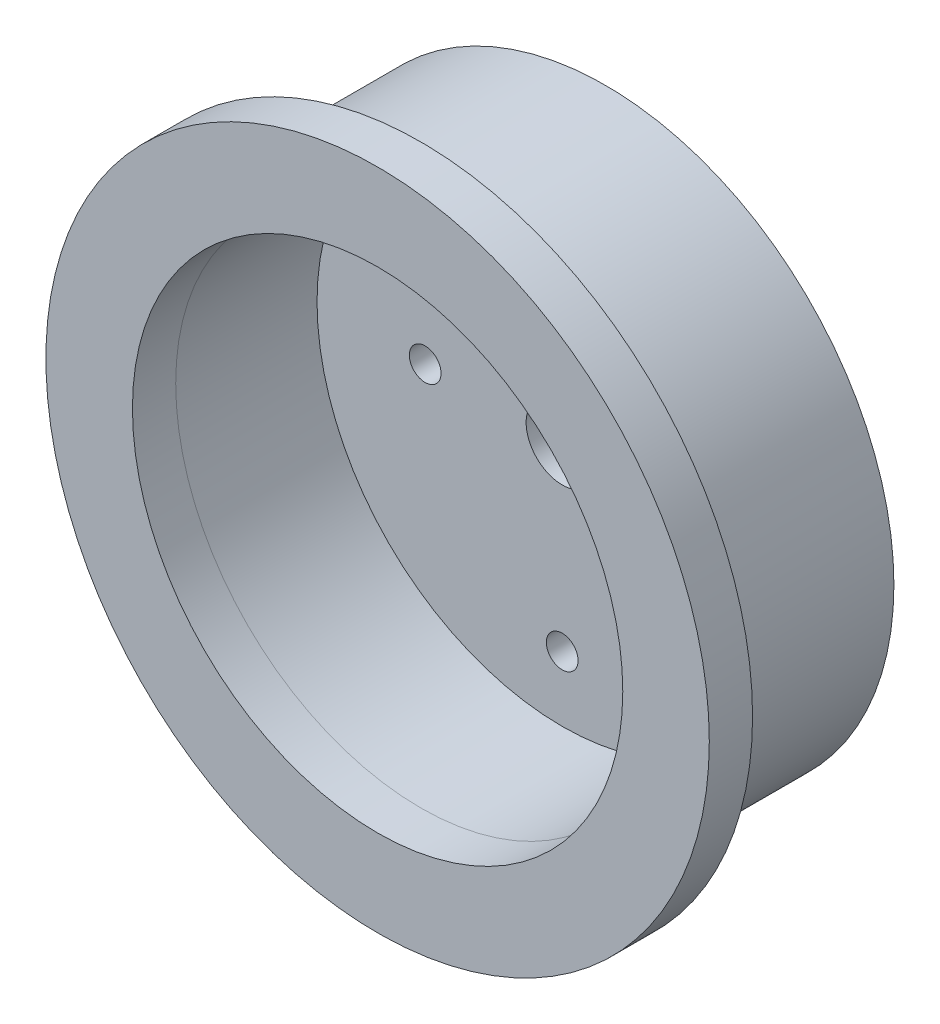
ISO-10303-21;
HEADER;
FILE_DESCRIPTION(('STEP AP214'),'2;1');
FILE_NAME('part.step','',(''),(''),'','','');
FILE_SCHEMA(('AUTOMOTIVE_DESIGN { 1 0 10303 214 1 1 1 1 }'));
ENDSEC;
DATA;
#1=APPLICATION_CONTEXT('core data for automotive mechanical design processes');
#2=APPLICATION_PROTOCOL_DEFINITION('international standard','automotive_design',2000,#1);
#3=PRODUCT_CONTEXT('',#1,'mechanical');
#4=PRODUCT('Part','Part','',(#3));
#5=PRODUCT_RELATED_PRODUCT_CATEGORY('part','',(#4));
#6=PRODUCT_DEFINITION_FORMATION('','',#4);
#7=PRODUCT_DEFINITION_CONTEXT('part definition',#1,'design');
#8=PRODUCT_DEFINITION('design','',#6,#7);
#9=PRODUCT_DEFINITION_SHAPE('','',#8);
#10=(LENGTH_UNIT() NAMED_UNIT(*) SI_UNIT(.MILLI.,.METRE.));
#11=(NAMED_UNIT(*) PLANE_ANGLE_UNIT() SI_UNIT($,.RADIAN.));
#12=(NAMED_UNIT(*) SI_UNIT($,.STERADIAN.) SOLID_ANGLE_UNIT());
#13=UNCERTAINTY_MEASURE_WITH_UNIT(LENGTH_MEASURE(1.E-05),#10,'distance_accuracy_value','');
#14=(GEOMETRIC_REPRESENTATION_CONTEXT(3) GLOBAL_UNCERTAINTY_ASSIGNED_CONTEXT((#13)) GLOBAL_UNIT_ASSIGNED_CONTEXT((#10,
#11,#12)) REPRESENTATION_CONTEXT('',''));
#15=CARTESIAN_POINT('',(0.,0.,0.));
#16=DIRECTION('',(0.,0.,1.));
#17=DIRECTION('',(1.,0.,0.));
#18=AXIS2_PLACEMENT_3D('',#15,#16,#17);
#19=CARTESIAN_POINT('',(0.,0.,15.8));
#20=DIRECTION('',(0.,0.,1.));
#21=DIRECTION('',(1.,0.,0.));
#22=AXIS2_PLACEMENT_3D('',#19,#20,#21);
#23=PLANE('',#22);
#24=CARTESIAN_POINT('',(0.,0.,15.8));
#25=DIRECTION('',(0.,0.,1.));
#26=DIRECTION('',(1.,0.,0.));
#27=AXIS2_PLACEMENT_3D('',#24,#25,#26);
#28=CIRCLE('',#27,23.);
#29=CARTESIAN_POINT('',(23.,0.,15.8));
#30=VERTEX_POINT('',#29);
#31=EDGE_CURVE('E11',#30,#30,#28,.T.);
#32=ORIENTED_EDGE('',*,*,#31,.T.);
#33=EDGE_LOOP('',(#32));
#34=FACE_BOUND('',#33,.T.);
#35=CARTESIAN_POINT('',(0.,0.,15.8));
#36=DIRECTION('',(0.,0.,1.));
#37=DIRECTION('',(1.,0.,0.));
#38=AXIS2_PLACEMENT_3D('',#35,#36,#37);
#39=CIRCLE('',#38,17.);
#40=CARTESIAN_POINT('',(17.,0.,15.8));
#41=VERTEX_POINT('',#40);
#42=EDGE_CURVE('E54',#41,#41,#39,.T.);
#43=ORIENTED_EDGE('',*,*,#42,.F.);
#44=EDGE_LOOP('',(#43));
#45=FACE_BOUND('',#44,.T.);
#46=ADVANCED_FACE('F43',(#34,#45),#23,.T.);
#47=CARTESIAN_POINT('',(0.,0.,12.8));
#48=DIRECTION('',(0.,0.,1.));
#49=DIRECTION('',(1.,0.,0.));
#50=AXIS2_PLACEMENT_3D('',#47,#48,#49);
#51=PLANE('',#50);
#52=CARTESIAN_POINT('',(0.,0.,12.8));
#53=DIRECTION('',(0.,0.,1.));
#54=DIRECTION('',(1.,0.,0.));
#55=AXIS2_PLACEMENT_3D('',#52,#53,#54);
#56=CIRCLE('',#55,23.);
#57=CARTESIAN_POINT('',(23.,0.,12.8));
#58=VERTEX_POINT('',#57);
#59=EDGE_CURVE('E47',#58,#58,#56,.T.);
#60=ORIENTED_EDGE('',*,*,#59,.F.);
#61=EDGE_LOOP('',(#60));
#62=FACE_BOUND('',#61,.T.);
#63=CARTESIAN_POINT('',(0.,0.,12.8));
#64=DIRECTION('',(0.,0.,1.));
#65=DIRECTION('',(1.,0.,0.));
#66=AXIS2_PLACEMENT_3D('',#63,#64,#65);
#67=CIRCLE('',#66,17.);
#68=CARTESIAN_POINT('',(17.,0.,12.8));
#69=VERTEX_POINT('',#68);
#70=EDGE_CURVE('E56',#69,#69,#67,.T.);
#71=ORIENTED_EDGE('',*,*,#70,.T.);
#72=EDGE_LOOP('',(#71));
#73=FACE_BOUND('',#72,.T.);
#74=ADVANCED_FACE('F66',(#62,#73),#51,.F.);
#75=CARTESIAN_POINT('',(0.,0.,15.8));
#76=DIRECTION('',(0.,0.,-1.));
#77=DIRECTION('',(-1.,0.,0.));
#78=AXIS2_PLACEMENT_3D('',#75,#76,#77);
#79=CYLINDRICAL_SURFACE('',#78,23.);
#80=ORIENTED_EDGE('',*,*,#31,.F.);
#81=EDGE_LOOP('',(#80));
#82=FACE_BOUND('',#81,.T.);
#83=ORIENTED_EDGE('',*,*,#59,.T.);
#84=EDGE_LOOP('',(#83));
#85=FACE_BOUND('',#84,.T.);
#86=ADVANCED_FACE('F45',(#82,#85),#79,.T.);
#87=CARTESIAN_POINT('',(0.,0.,15.8));
#88=DIRECTION('',(0.,0.,-1.));
#89=DIRECTION('',(-1.,0.,0.));
#90=AXIS2_PLACEMENT_3D('',#87,#88,#89);
#91=CYLINDRICAL_SURFACE('',#90,17.);
#92=ORIENTED_EDGE('',*,*,#42,.T.);
#93=EDGE_LOOP('',(#92));
#94=FACE_BOUND('',#93,.T.);
#95=ORIENTED_EDGE('',*,*,#70,.F.);
#96=EDGE_LOOP('',(#95));
#97=FACE_BOUND('',#96,.T.);
#98=ADVANCED_FACE('F62',(#94,#97),#91,.F.);
#99=CLOSED_SHELL('',(#46,#74,#86,#98));
#100=MANIFOLD_SOLID_BREP('B2',#99);
#101=CARTESIAN_POINT('',(0.,0.,12.8));
#102=DIRECTION('',(0.,0.,-1.));
#103=DIRECTION('',(-1.,0.,0.));
#104=AXIS2_PLACEMENT_3D('',#101,#102,#103);
#105=CYLINDRICAL_SURFACE('',#104,20.);
#106=CARTESIAN_POINT('',(0.,0.,12.8));
#107=DIRECTION('',(0.,0.,1.));
#108=DIRECTION('',(1.,0.,0.));
#109=AXIS2_PLACEMENT_3D('',#106,#107,#108);
#110=CIRCLE('',#109,20.);
#111=CARTESIAN_POINT('',(20.,0.,12.8));
#112=VERTEX_POINT('',#111);
#113=EDGE_CURVE('E42',#112,#112,#110,.T.);
#114=ORIENTED_EDGE('',*,*,#113,.F.);
#115=EDGE_LOOP('',(#114));
#116=FACE_BOUND('',#115,.T.);
#117=CARTESIAN_POINT('',(0.,0.,0.));
#118=DIRECTION('',(0.,0.,1.));
#119=DIRECTION('',(1.,0.,0.));
#120=AXIS2_PLACEMENT_3D('',#117,#118,#119);
#121=CIRCLE('',#120,20.);
#122=CARTESIAN_POINT('',(20.,0.,0.));
#123=VERTEX_POINT('',#122);
#124=EDGE_CURVE('E108',#123,#123,#121,.T.);
#125=ORIENTED_EDGE('',*,*,#124,.T.);
#126=EDGE_LOOP('',(#125));
#127=FACE_BOUND('',#126,.T.);
#128=ADVANCED_FACE('F105',(#116,#127),#105,.T.);
#129=CARTESIAN_POINT('',(0.,0.,12.8));
#130=DIRECTION('',(0.,0.,1.));
#131=DIRECTION('',(1.,0.,0.));
#132=AXIS2_PLACEMENT_3D('',#129,#130,#131);
#133=PLANE('',#132);
#134=CARTESIAN_POINT('',(0.,0.,12.8));
#135=DIRECTION('',(0.,0.,1.));
#136=DIRECTION('',(1.,0.,0.));
#137=AXIS2_PLACEMENT_3D('',#134,#135,#136);
#138=CIRCLE('',#137,17.);
#139=CARTESIAN_POINT('',(17.,0.,12.8));
#140=VERTEX_POINT('',#139);
#141=EDGE_CURVE('E117',#140,#140,#138,.T.);
#142=ORIENTED_EDGE('',*,*,#141,.F.);
#143=EDGE_LOOP('',(#142));
#144=FACE_BOUND('',#143,.T.);
#145=ORIENTED_EDGE('',*,*,#113,.T.);
#146=EDGE_LOOP('',(#145));
#147=FACE_BOUND('',#146,.T.);
#148=ADVANCED_FACE('F178',(#144,#147),#133,.T.);
#149=CARTESIAN_POINT('',(0.,0.,0.));
#150=DIRECTION('',(0.,0.,1.));
#151=DIRECTION('',(1.,0.,0.));
#152=AXIS2_PLACEMENT_3D('',#149,#150,#151);
#153=PLANE('',#152);
#154=CARTESIAN_POINT('',(0.,0.,0.));
#155=DIRECTION('',(0.,0.,1.));
#156=DIRECTION('',(1.,0.,0.));
#157=AXIS2_PLACEMENT_3D('',#154,#155,#156);
#158=CIRCLE('',#157,2.5);
#159=CARTESIAN_POINT('',(2.5,0.,0.));
#160=VERTEX_POINT('',#159);
#161=EDGE_CURVE('E133',#160,#160,#158,.T.);
#162=ORIENTED_EDGE('',*,*,#161,.T.);
#163=EDGE_LOOP('',(#162));
#164=FACE_BOUND('',#163,.T.);
#165=CARTESIAN_POINT('',(0.,12.5,0.));
#166=DIRECTION('',(0.,0.,1.));
#167=DIRECTION('',(1.,0.,0.));
#168=AXIS2_PLACEMENT_3D('',#165,#166,#167);
#169=CIRCLE('',#168,1.1);
#170=CARTESIAN_POINT('',(1.1,12.5,0.));
#171=VERTEX_POINT('',#170);
#172=EDGE_CURVE('E126',#171,#171,#169,.T.);
#173=ORIENTED_EDGE('',*,*,#172,.T.);
#174=EDGE_LOOP('',(#173));
#175=FACE_BOUND('',#174,.T.);
#176=CARTESIAN_POINT('',(9.5,0.,0.));
#177=DIRECTION('',(0.,0.,1.));
#178=DIRECTION('',(1.,0.,0.));
#179=AXIS2_PLACEMENT_3D('',#176,#177,#178);
#180=CIRCLE('',#179,1.1);
#181=CARTESIAN_POINT('',(10.6,0.,0.));
#182=VERTEX_POINT('',#181);
#183=EDGE_CURVE('E139',#182,#182,#180,.T.);
#184=ORIENTED_EDGE('',*,*,#183,.T.);
#185=EDGE_LOOP('',(#184));
#186=FACE_BOUND('',#185,.T.);
#187=CARTESIAN_POINT('',(-9.5,0.,0.));
#188=DIRECTION('',(0.,0.,1.));
#189=DIRECTION('',(1.,0.,0.));
#190=AXIS2_PLACEMENT_3D('',#187,#188,#189);
#191=CIRCLE('',#190,1.1);
#192=CARTESIAN_POINT('',(-8.4,0.,0.));
#193=VERTEX_POINT('',#192);
#194=EDGE_CURVE('E132',#193,#193,#191,.T.);
#195=ORIENTED_EDGE('',*,*,#194,.T.);
#196=EDGE_LOOP('',(#195));
#197=FACE_BOUND('',#196,.T.);
#198=CARTESIAN_POINT('',(0.,-12.5,0.));
#199=DIRECTION('',(0.,0.,1.));
#200=DIRECTION('',(1.,0.,0.));
#201=AXIS2_PLACEMENT_3D('',#198,#199,#200);
#202=CIRCLE('',#201,1.1);
#203=CARTESIAN_POINT('',(1.1,-12.5,0.));
#204=VERTEX_POINT('',#203);
#205=EDGE_CURVE('E120',#204,#204,#202,.T.);
#206=ORIENTED_EDGE('',*,*,#205,.T.);
#207=EDGE_LOOP('',(#206));
#208=FACE_BOUND('',#207,.T.);
#209=ORIENTED_EDGE('',*,*,#124,.F.);
#210=EDGE_LOOP('',(#209));
#211=FACE_BOUND('',#210,.T.);
#212=ADVANCED_FACE('F174',(#164,#175,#186,#197,#208,#211),#153,.F.);
#213=CARTESIAN_POINT('',(0.,0.,3.));
#214=DIRECTION('',(0.,0.,1.));
#215=DIRECTION('',(1.,0.,0.));
#216=AXIS2_PLACEMENT_3D('',#213,#214,#215);
#217=CYLINDRICAL_SURFACE('',#216,17.);
#218=CARTESIAN_POINT('',(0.,0.,3.));
#219=DIRECTION('',(0.,0.,1.));
#220=DIRECTION('',(1.,0.,0.));
#221=AXIS2_PLACEMENT_3D('',#218,#219,#220);
#222=CIRCLE('',#221,17.);
#223=CARTESIAN_POINT('',(17.,0.,3.));
#224=VERTEX_POINT('',#223);
#225=EDGE_CURVE('E115',#224,#224,#222,.T.);
#226=ORIENTED_EDGE('',*,*,#225,.F.);
#227=EDGE_LOOP('',(#226));
#228=FACE_BOUND('',#227,.T.);
#229=ORIENTED_EDGE('',*,*,#141,.T.);
#230=EDGE_LOOP('',(#229));
#231=FACE_BOUND('',#230,.T.);
#232=ADVANCED_FACE('F160',(#228,#231),#217,.F.);
#233=CARTESIAN_POINT('',(0.,0.,3.));
#234=DIRECTION('',(0.,0.,1.));
#235=DIRECTION('',(1.,0.,0.));
#236=AXIS2_PLACEMENT_3D('',#233,#234,#235);
#237=PLANE('',#236);
#238=CARTESIAN_POINT('',(0.,0.,3.));
#239=DIRECTION('',(0.,0.,1.));
#240=DIRECTION('',(1.,0.,0.));
#241=AXIS2_PLACEMENT_3D('',#238,#239,#240);
#242=CIRCLE('',#241,2.5);
#243=CARTESIAN_POINT('',(2.5,0.,3.));
#244=VERTEX_POINT('',#243);
#245=EDGE_CURVE('E149',#244,#244,#242,.T.);
#246=ORIENTED_EDGE('',*,*,#245,.F.);
#247=EDGE_LOOP('',(#246));
#248=FACE_BOUND('',#247,.T.);
#249=CARTESIAN_POINT('',(0.,12.5,3.));
#250=DIRECTION('',(0.,0.,1.));
#251=DIRECTION('',(1.,0.,0.));
#252=AXIS2_PLACEMENT_3D('',#249,#250,#251);
#253=CIRCLE('',#252,1.1);
#254=CARTESIAN_POINT('',(1.1,12.5,3.));
#255=VERTEX_POINT('',#254);
#256=EDGE_CURVE('E142',#255,#255,#253,.T.);
#257=ORIENTED_EDGE('',*,*,#256,.F.);
#258=EDGE_LOOP('',(#257));
#259=FACE_BOUND('',#258,.T.);
#260=CARTESIAN_POINT('',(9.5,0.,3.));
#261=DIRECTION('',(0.,0.,1.));
#262=DIRECTION('',(1.,0.,0.));
#263=AXIS2_PLACEMENT_3D('',#260,#261,#262);
#264=CIRCLE('',#263,1.1);
#265=CARTESIAN_POINT('',(10.6,0.,3.));
#266=VERTEX_POINT('',#265);
#267=EDGE_CURVE('E136',#266,#266,#264,.T.);
#268=ORIENTED_EDGE('',*,*,#267,.F.);
#269=EDGE_LOOP('',(#268));
#270=FACE_BOUND('',#269,.T.);
#271=CARTESIAN_POINT('',(-9.5,0.,3.));
#272=DIRECTION('',(0.,0.,1.));
#273=DIRECTION('',(1.,0.,0.));
#274=AXIS2_PLACEMENT_3D('',#271,#272,#273);
#275=CIRCLE('',#274,1.1);
#276=CARTESIAN_POINT('',(-8.4,0.,3.));
#277=VERTEX_POINT('',#276);
#278=EDGE_CURVE('E129',#277,#277,#275,.T.);
#279=ORIENTED_EDGE('',*,*,#278,.F.);
#280=EDGE_LOOP('',(#279));
#281=FACE_BOUND('',#280,.T.);
#282=CARTESIAN_POINT('',(0.,-12.5,3.));
#283=DIRECTION('',(0.,0.,1.));
#284=DIRECTION('',(1.,0.,0.));
#285=AXIS2_PLACEMENT_3D('',#282,#283,#284);
#286=CIRCLE('',#285,1.1);
#287=CARTESIAN_POINT('',(1.1,-12.5,3.));
#288=VERTEX_POINT('',#287);
#289=EDGE_CURVE('E123',#288,#288,#286,.T.);
#290=ORIENTED_EDGE('',*,*,#289,.F.);
#291=EDGE_LOOP('',(#290));
#292=FACE_BOUND('',#291,.T.);
#293=ORIENTED_EDGE('',*,*,#225,.T.);
#294=EDGE_LOOP('',(#293));
#295=FACE_BOUND('',#294,.T.);
#296=ADVANCED_FACE('F156',(#248,#259,#270,#281,#292,#295),#237,.T.);
#297=CARTESIAN_POINT('',(0.,-12.5,0.));
#298=DIRECTION('',(0.,0.,1.));
#299=DIRECTION('',(1.,0.,0.));
#300=AXIS2_PLACEMENT_3D('',#297,#298,#299);
#301=CYLINDRICAL_SURFACE('',#300,1.1);
#302=ORIENTED_EDGE('',*,*,#205,.F.);
#303=EDGE_LOOP('',(#302));
#304=FACE_BOUND('',#303,.T.);
#305=ORIENTED_EDGE('',*,*,#289,.T.);
#306=EDGE_LOOP('',(#305));
#307=FACE_BOUND('',#306,.T.);
#308=ADVANCED_FACE('F159',(#304,#307),#301,.F.);
#309=CARTESIAN_POINT('',(-9.5,0.,0.));
#310=DIRECTION('',(0.,0.,1.));
#311=DIRECTION('',(1.,0.,0.));
#312=AXIS2_PLACEMENT_3D('',#309,#310,#311);
#313=CYLINDRICAL_SURFACE('',#312,1.1);
#314=ORIENTED_EDGE('',*,*,#194,.F.);
#315=EDGE_LOOP('',(#314));
#316=FACE_BOUND('',#315,.T.);
#317=ORIENTED_EDGE('',*,*,#278,.T.);
#318=EDGE_LOOP('',(#317));
#319=FACE_BOUND('',#318,.T.);
#320=ADVANCED_FACE('F190',(#316,#319),#313,.F.);
#321=CARTESIAN_POINT('',(9.5,0.,0.));
#322=DIRECTION('',(0.,0.,1.));
#323=DIRECTION('',(1.,0.,0.));
#324=AXIS2_PLACEMENT_3D('',#321,#322,#323);
#325=CYLINDRICAL_SURFACE('',#324,1.1);
#326=ORIENTED_EDGE('',*,*,#183,.F.);
#327=EDGE_LOOP('',(#326));
#328=FACE_BOUND('',#327,.T.);
#329=ORIENTED_EDGE('',*,*,#267,.T.);
#330=EDGE_LOOP('',(#329));
#331=FACE_BOUND('',#330,.T.);
#332=ADVANCED_FACE('F194',(#328,#331),#325,.F.);
#333=CARTESIAN_POINT('',(0.,12.5,0.));
#334=DIRECTION('',(0.,0.,1.));
#335=DIRECTION('',(1.,0.,0.));
#336=AXIS2_PLACEMENT_3D('',#333,#334,#335);
#337=CYLINDRICAL_SURFACE('',#336,1.1);
#338=ORIENTED_EDGE('',*,*,#172,.F.);
#339=EDGE_LOOP('',(#338));
#340=FACE_BOUND('',#339,.T.);
#341=ORIENTED_EDGE('',*,*,#256,.T.);
#342=EDGE_LOOP('',(#341));
#343=FACE_BOUND('',#342,.T.);
#344=ADVANCED_FACE('F198',(#340,#343),#337,.F.);
#345=CARTESIAN_POINT('',(0.,0.,-7.));
#346=DIRECTION('',(0.,0.,1.));
#347=DIRECTION('',(1.,0.,0.));
#348=AXIS2_PLACEMENT_3D('',#345,#346,#347);
#349=CYLINDRICAL_SURFACE('',#348,2.5);
#350=ORIENTED_EDGE('',*,*,#245,.T.);
#351=EDGE_LOOP('',(#350));
#352=FACE_BOUND('',#351,.T.);
#353=ORIENTED_EDGE('',*,*,#161,.F.);
#354=EDGE_LOOP('',(#353));
#355=FACE_BOUND('',#354,.T.);
#356=ADVANCED_FACE('F153',(#352,#355),#349,.F.);
#357=CLOSED_SHELL('',(#128,#148,#212,#232,#296,#308,#320,#332,#344,#356));
#358=MANIFOLD_SOLID_BREP('B6',#357);
#359=ADVANCED_BREP_SHAPE_REPRESENTATION('',(#18,#100,#358),#14);
#360=SHAPE_DEFINITION_REPRESENTATION(#9,#359);
ENDSEC;
END-ISO-10303-21;
